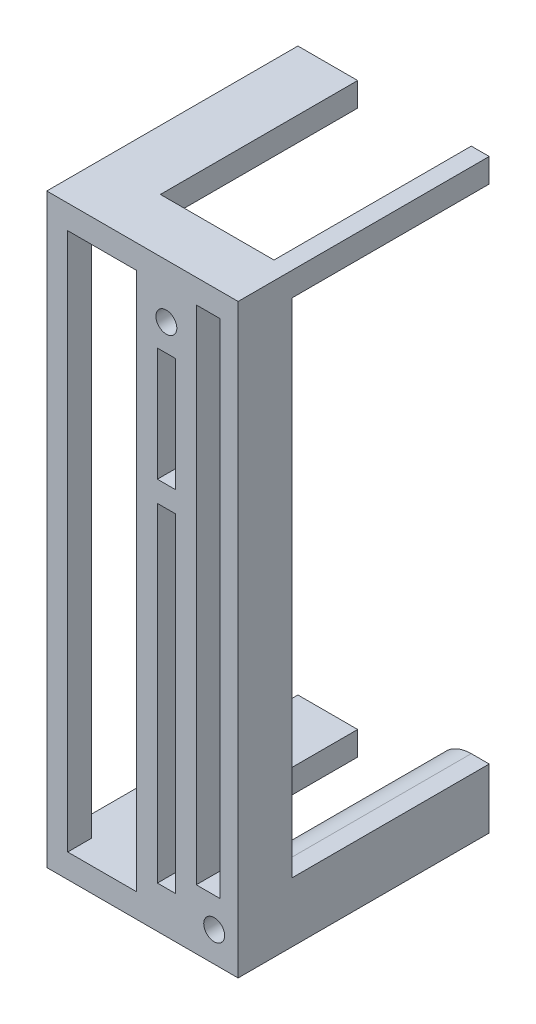
ISO-10303-21;
HEADER;
FILE_DESCRIPTION(('STEP AP214'),'2;1');
FILE_NAME('part.step','',(''),(''),'','','');
FILE_SCHEMA(('AUTOMOTIVE_DESIGN { 1 0 10303 214 1 1 1 1 }'));
ENDSEC;
DATA;
#1=APPLICATION_CONTEXT('core data for automotive mechanical design processes');
#2=APPLICATION_PROTOCOL_DEFINITION('international standard','automotive_design',2000,#1);
#3=PRODUCT_CONTEXT('',#1,'mechanical');
#4=PRODUCT('Part','Part','',(#3));
#5=PRODUCT_RELATED_PRODUCT_CATEGORY('part','',(#4));
#6=PRODUCT_DEFINITION_FORMATION('','',#4);
#7=PRODUCT_DEFINITION_CONTEXT('part definition',#1,'design');
#8=PRODUCT_DEFINITION('design','',#6,#7);
#9=PRODUCT_DEFINITION_SHAPE('','',#8);
#10=(LENGTH_UNIT() NAMED_UNIT(*) SI_UNIT(.MILLI.,.METRE.));
#11=(NAMED_UNIT(*) PLANE_ANGLE_UNIT() SI_UNIT($,.RADIAN.));
#12=(NAMED_UNIT(*) SI_UNIT($,.STERADIAN.) SOLID_ANGLE_UNIT());
#13=UNCERTAINTY_MEASURE_WITH_UNIT(LENGTH_MEASURE(1.E-05),#10,'distance_accuracy_value','');
#14=(GEOMETRIC_REPRESENTATION_CONTEXT(3) GLOBAL_UNCERTAINTY_ASSIGNED_CONTEXT((#13)) GLOBAL_UNIT_ASSIGNED_CONTEXT((#10,
#11,#12)) REPRESENTATION_CONTEXT('',''));
#15=CARTESIAN_POINT('',(0.,0.,0.));
#16=DIRECTION('',(0.,0.,1.));
#17=DIRECTION('',(1.,0.,0.));
#18=AXIS2_PLACEMENT_3D('',#15,#16,#17);
#19=CARTESIAN_POINT('',(0.,0.,4.));
#20=DIRECTION('',(0.,0.,1.));
#21=DIRECTION('',(1.,0.,0.));
#22=AXIS2_PLACEMENT_3D('',#19,#20,#21);
#23=PLANE('',#22);
#24=CARTESIAN_POINT('',(28.,5.,4.));
#25=DIRECTION('',(0.,0.,-1.));
#26=DIRECTION('',(-1.,0.,0.));
#27=AXIS2_PLACEMENT_3D('',#24,#25,#26);
#28=CIRCLE('',#27,1.75);
#29=CARTESIAN_POINT('',(26.25,5.,4.));
#30=VERTEX_POINT('',#29);
#31=EDGE_CURVE('E349',#30,#30,#28,.T.);
#32=ORIENTED_EDGE('',*,*,#31,.T.);
#33=EDGE_LOOP('',(#32));
#34=FACE_BOUND('',#33,.T.);
#35=DIRECTION('',(0.,1.,0.));
#36=VECTOR('',#35,1.);
#37=CARTESIAN_POINT('',(32.,0.,4.));
#38=LINE('',#37,#36);
#39=CARTESIAN_POINT('',(32.,0.,4.));
#40=VERTEX_POINT('',#39);
#41=CARTESIAN_POINT('',(32.,98.,4.));
#42=VERTEX_POINT('',#41);
#43=EDGE_CURVE('E463',#40,#42,#38,.T.);
#44=ORIENTED_EDGE('',*,*,#43,.T.);
#45=DIRECTION('',(1.,0.,0.));
#46=VECTOR('',#45,1.);
#47=CARTESIAN_POINT('',(0.,98.,4.));
#48=LINE('',#47,#46);
#49=CARTESIAN_POINT('',(0.,98.,4.));
#50=VERTEX_POINT('',#49);
#51=EDGE_CURVE('E465',#50,#42,#48,.T.);
#52=ORIENTED_EDGE('',*,*,#51,.F.);
#53=DIRECTION('',(0.,1.,0.));
#54=VECTOR('',#53,1.);
#55=CARTESIAN_POINT('',(0.,0.,4.));
#56=LINE('',#55,#54);
#57=CARTESIAN_POINT('',(0.,0.,4.));
#58=VERTEX_POINT('',#57);
#59=EDGE_CURVE('E469',#58,#50,#56,.T.);
#60=ORIENTED_EDGE('',*,*,#59,.F.);
#61=DIRECTION('',(1.,0.,0.));
#62=VECTOR('',#61,1.);
#63=CARTESIAN_POINT('',(0.,0.,4.));
#64=LINE('',#63,#62);
#65=EDGE_CURVE('E472',#58,#40,#64,.T.);
#66=ORIENTED_EDGE('',*,*,#65,.T.);
#67=EDGE_LOOP('',(#44,#52,#60,#66));
#68=FACE_BOUND('',#67,.T.);
#69=DIRECTION('',(0.,1.,0.));
#70=VECTOR('',#69,1.);
#71=CARTESIAN_POINT('',(21.5,0.,4.));
#72=LINE('',#71,#70);
#73=CARTESIAN_POINT('',(21.5,7.,4.));
#74=VERTEX_POINT('',#73);
#75=CARTESIAN_POINT('',(21.5,62.,4.));
#76=VERTEX_POINT('',#75);
#77=EDGE_CURVE('E474',#74,#76,#72,.T.);
#78=ORIENTED_EDGE('',*,*,#77,.F.);
#79=DIRECTION('',(-1.,0.,0.));
#80=VECTOR('',#79,1.);
#81=CARTESIAN_POINT('',(0.,7.,4.));
#82=LINE('',#81,#80);
#83=CARTESIAN_POINT('',(18.5,7.,4.));
#84=VERTEX_POINT('',#83);
#85=EDGE_CURVE('E477',#74,#84,#82,.T.);
#86=ORIENTED_EDGE('',*,*,#85,.T.);
#87=DIRECTION('',(0.,1.,0.));
#88=VECTOR('',#87,1.);
#89=CARTESIAN_POINT('',(18.5,0.,4.));
#90=LINE('',#89,#88);
#91=CARTESIAN_POINT('',(18.5,62.,4.));
#92=VERTEX_POINT('',#91);
#93=EDGE_CURVE('E480',#84,#92,#90,.T.);
#94=ORIENTED_EDGE('',*,*,#93,.T.);
#95=DIRECTION('',(1.,0.,0.));
#96=VECTOR('',#95,1.);
#97=CARTESIAN_POINT('',(0.,62.,4.));
#98=LINE('',#97,#96);
#99=EDGE_CURVE('E483',#92,#76,#98,.T.);
#100=ORIENTED_EDGE('',*,*,#99,.T.);
#101=EDGE_LOOP('',(#78,#86,#94,#100));
#102=FACE_BOUND('',#101,.T.);
#103=CARTESIAN_POINT('',(20.,89.,4.));
#104=DIRECTION('',(0.,0.,1.));
#105=DIRECTION('',(1.,0.,0.));
#106=AXIS2_PLACEMENT_3D('',#103,#104,#105);
#107=CIRCLE('',#106,1.75);
#108=CARTESIAN_POINT('',(21.75,89.,4.));
#109=VERTEX_POINT('',#108);
#110=EDGE_CURVE('E485',#109,#109,#107,.T.);
#111=ORIENTED_EDGE('',*,*,#110,.F.);
#112=EDGE_LOOP('',(#111));
#113=FACE_BOUND('',#112,.T.);
#114=DIRECTION('',(0.,-1.,0.));
#115=VECTOR('',#114,1.);
#116=CARTESIAN_POINT('',(29.,0.,4.));
#117=LINE('',#116,#115);
#118=CARTESIAN_POINT('',(29.,94.,4.));
#119=VERTEX_POINT('',#118);
#120=CARTESIAN_POINT('',(29.,10.,4.));
#121=VERTEX_POINT('',#120);
#122=EDGE_CURVE('E335',#119,#121,#117,.T.);
#123=ORIENTED_EDGE('',*,*,#122,.T.);
#124=DIRECTION('',(1.,0.,0.));
#125=VECTOR('',#124,1.);
#126=CARTESIAN_POINT('',(0.,10.,4.));
#127=LINE('',#126,#125);
#128=CARTESIAN_POINT('',(25.,10.,4.));
#129=VERTEX_POINT('',#128);
#130=EDGE_CURVE('E327',#129,#121,#127,.T.);
#131=ORIENTED_EDGE('',*,*,#130,.F.);
#132=DIRECTION('',(0.,-1.,0.));
#133=VECTOR('',#132,1.);
#134=CARTESIAN_POINT('',(25.,0.,4.));
#135=LINE('',#134,#133);
#136=CARTESIAN_POINT('',(25.,94.,4.));
#137=VERTEX_POINT('',#136);
#138=EDGE_CURVE('E329',#137,#129,#135,.T.);
#139=ORIENTED_EDGE('',*,*,#138,.F.);
#140=DIRECTION('',(1.,0.,0.));
#141=VECTOR('',#140,1.);
#142=CARTESIAN_POINT('',(0.,94.,4.));
#143=LINE('',#142,#141);
#144=EDGE_CURVE('E332',#137,#119,#143,.T.);
#145=ORIENTED_EDGE('',*,*,#144,.T.);
#146=EDGE_LOOP('',(#123,#131,#139,#145));
#147=FACE_BOUND('',#146,.T.);
#148=DIRECTION('',(1.,0.,0.));
#149=VECTOR('',#148,1.);
#150=CARTESIAN_POINT('',(0.,84.5,4.));
#151=LINE('',#150,#149);
#152=CARTESIAN_POINT('',(18.5,84.5,4.));
#153=VERTEX_POINT('',#152);
#154=CARTESIAN_POINT('',(21.5,84.5,4.));
#155=VERTEX_POINT('',#154);
#156=EDGE_CURVE('E304',#153,#155,#151,.T.);
#157=ORIENTED_EDGE('',*,*,#156,.T.);
#158=DIRECTION('',(0.,1.,0.));
#159=VECTOR('',#158,1.);
#160=CARTESIAN_POINT('',(21.5,0.,4.));
#161=LINE('',#160,#159);
#162=CARTESIAN_POINT('',(21.5,65.5,4.));
#163=VERTEX_POINT('',#162);
#164=EDGE_CURVE('E298',#163,#155,#161,.T.);
#165=ORIENTED_EDGE('',*,*,#164,.F.);
#166=DIRECTION('',(1.,0.,0.));
#167=VECTOR('',#166,1.);
#168=CARTESIAN_POINT('',(0.,65.5,4.));
#169=LINE('',#168,#167);
#170=CARTESIAN_POINT('',(18.5,65.5,4.));
#171=VERTEX_POINT('',#170);
#172=EDGE_CURVE('E300',#171,#163,#169,.T.);
#173=ORIENTED_EDGE('',*,*,#172,.F.);
#174=DIRECTION('',(0.,1.,0.));
#175=VECTOR('',#174,1.);
#176=CARTESIAN_POINT('',(18.5,0.,4.));
#177=LINE('',#176,#175);
#178=EDGE_CURVE('E70',#171,#153,#177,.T.);
#179=ORIENTED_EDGE('',*,*,#178,.T.);
#180=EDGE_LOOP('',(#157,#165,#173,#179));
#181=FACE_BOUND('',#180,.T.);
#182=DIRECTION('',(-1.,0.,0.));
#183=VECTOR('',#182,1.);
#184=CARTESIAN_POINT('',(0.,4.,4.));
#185=LINE('',#184,#183);
#186=CARTESIAN_POINT('',(15.,4.,4.));
#187=VERTEX_POINT('',#186);
#188=CARTESIAN_POINT('',(3.49999999999999,4.,4.));
#189=VERTEX_POINT('',#188);
#190=EDGE_CURVE('E273',#187,#189,#185,.T.);
#191=ORIENTED_EDGE('',*,*,#190,.T.);
#192=DIRECTION('',(0.,-1.,0.));
#193=VECTOR('',#192,1.);
#194=CARTESIAN_POINT('',(3.49999999999999,0.,4.));
#195=LINE('',#194,#193);
#196=CARTESIAN_POINT('',(3.5,94.,4.));
#197=VERTEX_POINT('',#196);
#198=EDGE_CURVE('E265',#197,#189,#195,.T.);
#199=ORIENTED_EDGE('',*,*,#198,.F.);
#200=DIRECTION('',(1.,0.,0.));
#201=VECTOR('',#200,1.);
#202=CARTESIAN_POINT('',(0.,94.,4.));
#203=LINE('',#202,#201);
#204=CARTESIAN_POINT('',(15.,94.,4.));
#205=VERTEX_POINT('',#204);
#206=EDGE_CURVE('E276',#197,#205,#203,.T.);
#207=ORIENTED_EDGE('',*,*,#206,.T.);
#208=DIRECTION('',(0.,-1.,0.));
#209=VECTOR('',#208,1.);
#210=CARTESIAN_POINT('',(15.,0.,4.));
#211=LINE('',#210,#209);
#212=EDGE_CURVE('E62',#205,#187,#211,.T.);
#213=ORIENTED_EDGE('',*,*,#212,.T.);
#214=EDGE_LOOP('',(#191,#199,#207,#213));
#215=FACE_BOUND('',#214,.T.);
#216=ADVANCED_FACE('F47',(#34,#68,#102,#113,#147,#181,#215),#23,.T.);
#217=CARTESIAN_POINT('',(0.,0.,0.));
#218=DIRECTION('',(0.,0.,1.));
#219=DIRECTION('',(1.,0.,0.));
#220=AXIS2_PLACEMENT_3D('',#217,#218,#219);
#221=PLANE('',#220);
#222=DIRECTION('',(0.,-1.,0.));
#223=VECTOR('',#222,1.);
#224=CARTESIAN_POINT('',(3.49999999999999,0.,0.));
#225=LINE('',#224,#223);
#226=CARTESIAN_POINT('',(3.49999999999999,94.,0.));
#227=VERTEX_POINT('',#226);
#228=CARTESIAN_POINT('',(3.49999999999999,4.,0.));
#229=VERTEX_POINT('',#228);
#230=EDGE_CURVE('E268',#227,#229,#225,.T.);
#231=ORIENTED_EDGE('',*,*,#230,.T.);
#232=DIRECTION('',(1.,0.,0.));
#233=VECTOR('',#232,1.);
#234=CARTESIAN_POINT('',(0.,4.,0.));
#235=LINE('',#234,#233);
#236=CARTESIAN_POINT('',(0.,4.,0.));
#237=VERTEX_POINT('',#236);
#238=EDGE_CURVE('E428',#237,#229,#235,.T.);
#239=ORIENTED_EDGE('',*,*,#238,.F.);
#240=DIRECTION('',(0.,1.,0.));
#241=VECTOR('',#240,1.);
#242=CARTESIAN_POINT('',(0.,0.,0.));
#243=LINE('',#242,#241);
#244=CARTESIAN_POINT('',(0.,94.,0.));
#245=VERTEX_POINT('',#244);
#246=EDGE_CURVE('E452',#237,#245,#243,.T.);
#247=ORIENTED_EDGE('',*,*,#246,.T.);
#248=DIRECTION('',(1.,0.,0.));
#249=VECTOR('',#248,1.);
#250=CARTESIAN_POINT('',(0.,94.,0.));
#251=LINE('',#250,#249);
#252=EDGE_CURVE('E444',#245,#227,#251,.T.);
#253=ORIENTED_EDGE('',*,*,#252,.T.);
#254=EDGE_LOOP('',(#231,#239,#247,#253));
#255=FACE_BOUND('',#254,.T.);
#256=ADVANCED_FACE('F643',(#255),#221,.F.);
#257=CARTESIAN_POINT('',(15.,4.,0.));
#258=VERTEX_POINT('',#257);
#259=CARTESIAN_POINT('',(23.,4.,0.));
#260=VERTEX_POINT('',#259);
#261=EDGE_CURVE('E446',#258,#260,#235,.T.);
#262=ORIENTED_EDGE('',*,*,#261,.F.);
#263=DIRECTION('',(0.,-1.,0.));
#264=VECTOR('',#263,1.);
#265=CARTESIAN_POINT('',(15.,0.,0.));
#266=LINE('',#265,#264);
#267=CARTESIAN_POINT('',(15.,94.,0.));
#268=VERTEX_POINT('',#267);
#269=EDGE_CURVE('E283',#268,#258,#266,.T.);
#270=ORIENTED_EDGE('',*,*,#269,.F.);
#271=CARTESIAN_POINT('',(25.,94.,0.));
#272=VERTEX_POINT('',#271);
#273=EDGE_CURVE('E421',#268,#272,#251,.T.);
#274=ORIENTED_EDGE('',*,*,#273,.T.);
#275=DIRECTION('',(0.,-1.,0.));
#276=VECTOR('',#275,1.);
#277=CARTESIAN_POINT('',(25.,0.,0.));
#278=LINE('',#277,#276);
#279=CARTESIAN_POINT('',(25.,10.,0.));
#280=VERTEX_POINT('',#279);
#281=EDGE_CURVE('E330',#272,#280,#278,.T.);
#282=ORIENTED_EDGE('',*,*,#281,.T.);
#283=DIRECTION('',(1.,0.,0.));
#284=VECTOR('',#283,1.);
#285=CARTESIAN_POINT('',(0.,10.,0.));
#286=LINE('',#285,#284);
#287=CARTESIAN_POINT('',(29.,10.,0.));
#288=VERTEX_POINT('',#287);
#289=EDGE_CURVE('E339',#280,#288,#286,.T.);
#290=ORIENTED_EDGE('',*,*,#289,.T.);
#291=CARTESIAN_POINT('',(29.,4.,0.));
#292=DIRECTION('',(0.,0.,1.));
#293=DIRECTION('',(1.,0.,0.));
#294=AXIS2_PLACEMENT_3D('',#291,#292,#293);
#295=CIRCLE('',#294,6.);
#296=EDGE_CURVE('E11',#260,#288,#295,.F.);
#297=ORIENTED_EDGE('',*,*,#296,.F.);
#298=EDGE_LOOP('',(#262,#270,#274,#282,#290,#297));
#299=FACE_BOUND('',#298,.T.);
#300=DIRECTION('',(0.,1.,0.));
#301=VECTOR('',#300,1.);
#302=CARTESIAN_POINT('',(21.5,0.,0.));
#303=LINE('',#302,#301);
#304=CARTESIAN_POINT('',(21.5,7.,0.));
#305=VERTEX_POINT('',#304);
#306=CARTESIAN_POINT('',(21.5,62.,0.));
#307=VERTEX_POINT('',#306);
#308=EDGE_CURVE('E490',#305,#307,#303,.T.);
#309=ORIENTED_EDGE('',*,*,#308,.T.);
#310=DIRECTION('',(1.,0.,0.));
#311=VECTOR('',#310,1.);
#312=CARTESIAN_POINT('',(0.,62.,0.));
#313=LINE('',#312,#311);
#314=CARTESIAN_POINT('',(18.5,62.,0.));
#315=VERTEX_POINT('',#314);
#316=EDGE_CURVE('E499',#315,#307,#313,.T.);
#317=ORIENTED_EDGE('',*,*,#316,.F.);
#318=DIRECTION('',(0.,1.,0.));
#319=VECTOR('',#318,1.);
#320=CARTESIAN_POINT('',(18.5,0.,0.));
#321=LINE('',#320,#319);
#322=CARTESIAN_POINT('',(18.5,7.,0.));
#323=VERTEX_POINT('',#322);
#324=EDGE_CURVE('E496',#323,#315,#321,.T.);
#325=ORIENTED_EDGE('',*,*,#324,.F.);
#326=DIRECTION('',(-1.,0.,0.));
#327=VECTOR('',#326,1.);
#328=CARTESIAN_POINT('',(0.,7.,0.));
#329=LINE('',#328,#327);
#330=EDGE_CURVE('E493',#305,#323,#329,.T.);
#331=ORIENTED_EDGE('',*,*,#330,.F.);
#332=EDGE_LOOP('',(#309,#317,#325,#331));
#333=FACE_BOUND('',#332,.T.);
#334=CARTESIAN_POINT('',(20.,89.,0.));
#335=DIRECTION('',(0.,0.,1.));
#336=DIRECTION('',(1.,0.,0.));
#337=AXIS2_PLACEMENT_3D('',#334,#335,#336);
#338=CIRCLE('',#337,1.75);
#339=CARTESIAN_POINT('',(21.75,89.,0.));
#340=VERTEX_POINT('',#339);
#341=EDGE_CURVE('E466',#340,#340,#338,.T.);
#342=ORIENTED_EDGE('',*,*,#341,.T.);
#343=EDGE_LOOP('',(#342));
#344=FACE_BOUND('',#343,.T.);
#345=DIRECTION('',(0.,1.,0.));
#346=VECTOR('',#345,1.);
#347=CARTESIAN_POINT('',(21.5,0.,0.));
#348=LINE('',#347,#346);
#349=CARTESIAN_POINT('',(21.5,65.5,0.));
#350=VERTEX_POINT('',#349);
#351=CARTESIAN_POINT('',(21.5,84.5,0.));
#352=VERTEX_POINT('',#351);
#353=EDGE_CURVE('E308',#350,#352,#348,.T.);
#354=ORIENTED_EDGE('',*,*,#353,.T.);
#355=DIRECTION('',(1.,0.,0.));
#356=VECTOR('',#355,1.);
#357=CARTESIAN_POINT('',(0.,84.5,0.));
#358=LINE('',#357,#356);
#359=CARTESIAN_POINT('',(18.5,84.5,0.));
#360=VERTEX_POINT('',#359);
#361=EDGE_CURVE('E301',#360,#352,#358,.T.);
#362=ORIENTED_EDGE('',*,*,#361,.F.);
#363=DIRECTION('',(0.,1.,0.));
#364=VECTOR('',#363,1.);
#365=CARTESIAN_POINT('',(18.5,0.,0.));
#366=LINE('',#365,#364);
#367=CARTESIAN_POINT('',(18.5,65.5,0.));
#368=VERTEX_POINT('',#367);
#369=EDGE_CURVE('E315',#368,#360,#366,.T.);
#370=ORIENTED_EDGE('',*,*,#369,.F.);
#371=DIRECTION('',(1.,0.,0.));
#372=VECTOR('',#371,1.);
#373=CARTESIAN_POINT('',(0.,65.5,0.));
#374=LINE('',#373,#372);
#375=EDGE_CURVE('E311',#368,#350,#374,.T.);
#376=ORIENTED_EDGE('',*,*,#375,.T.);
#377=EDGE_LOOP('',(#354,#362,#370,#376));
#378=FACE_BOUND('',#377,.T.);
#379=ADVANCED_FACE('F614',(#299,#333,#344,#378),#221,.F.);
#380=CARTESIAN_POINT('',(29.,4.,-5.));
#381=DIRECTION('',(0.,0.,1.));
#382=DIRECTION('',(1.,0.,0.));
#383=AXIS2_PLACEMENT_3D('',#380,#381,#382);
#384=CYLINDRICAL_SURFACE('',#383,6.);
#385=DIRECTION('',(0.,0.,-1.));
#386=VECTOR('',#385,1.);
#387=CARTESIAN_POINT('',(23.,4.,-5.));
#388=LINE('',#387,#386);
#389=CARTESIAN_POINT('',(23.,4.,-5.));
#390=VERTEX_POINT('',#389);
#391=CARTESIAN_POINT('',(23.,4.,-38.));
#392=VERTEX_POINT('',#391);
#393=EDGE_CURVE('E538',#390,#392,#388,.T.);
#394=ORIENTED_EDGE('',*,*,#393,.F.);
#395=DIRECTION('',(0.,0.,1.));
#396=VECTOR('',#395,1.);
#397=CARTESIAN_POINT('',(23.,4.,-5.));
#398=LINE('',#397,#396);
#399=EDGE_CURVE('E453',#390,#260,#398,.T.);
#400=ORIENTED_EDGE('',*,*,#399,.T.);
#401=ORIENTED_EDGE('',*,*,#296,.T.);
#402=DIRECTION('',(0.,0.,1.));
#403=VECTOR('',#402,1.);
#404=CARTESIAN_POINT('',(29.,10.,-5.));
#405=LINE('',#404,#403);
#406=CARTESIAN_POINT('',(29.,10.,-5.));
#407=VERTEX_POINT('',#406);
#408=EDGE_CURVE('E456',#407,#288,#405,.T.);
#409=ORIENTED_EDGE('',*,*,#408,.F.);
#410=DIRECTION('',(0.,0.,-1.));
#411=VECTOR('',#410,1.);
#412=CARTESIAN_POINT('',(29.,10.,-5.));
#413=LINE('',#412,#411);
#414=CARTESIAN_POINT('',(29.,10.,-38.));
#415=VERTEX_POINT('',#414);
#416=EDGE_CURVE('E541',#415,#407,#413,.F.);
#417=ORIENTED_EDGE('',*,*,#416,.F.);
#418=CARTESIAN_POINT('',(29.,4.,-38.));
#419=DIRECTION('',(0.,0.,1.));
#420=DIRECTION('',(1.,0.,0.));
#421=AXIS2_PLACEMENT_3D('',#418,#419,#420);
#422=CIRCLE('',#421,6.);
#423=EDGE_CURVE('E55',#392,#415,#422,.F.);
#424=ORIENTED_EDGE('',*,*,#423,.F.);
#425=EDGE_LOOP('',(#394,#400,#401,#409,#417,#424));
#426=FACE_BOUND('',#425,.T.);
#427=ADVANCED_FACE('F49',(#426),#384,.T.);
#428=CARTESIAN_POINT('',(0.,0.,-5.));
#429=DIRECTION('',(0.,0.,1.));
#430=DIRECTION('',(1.,0.,0.));
#431=AXIS2_PLACEMENT_3D('',#428,#429,#430);
#432=PLANE('',#431);
#433=DIRECTION('',(0.,1.,0.));
#434=VECTOR('',#433,1.);
#435=CARTESIAN_POINT('',(29.,0.,-5.));
#436=LINE('',#435,#434);
#437=CARTESIAN_POINT('',(29.,94.,-5.));
#438=VERTEX_POINT('',#437);
#439=CARTESIAN_POINT('',(29.,98.,-5.));
#440=VERTEX_POINT('',#439);
#441=EDGE_CURVE('E536',#438,#440,#436,.T.);
#442=ORIENTED_EDGE('',*,*,#441,.F.);
#443=DIRECTION('',(1.,0.,0.));
#444=VECTOR('',#443,1.);
#445=CARTESIAN_POINT('',(0.,94.,-5.));
#446=LINE('',#445,#444);
#447=CARTESIAN_POINT('',(10.,94.,-5.));
#448=VERTEX_POINT('',#447);
#449=EDGE_CURVE('E431',#448,#438,#446,.T.);
#450=ORIENTED_EDGE('',*,*,#449,.F.);
#451=DIRECTION('',(0.,1.,0.));
#452=VECTOR('',#451,1.);
#453=CARTESIAN_POINT('',(10.,0.,-5.));
#454=LINE('',#453,#452);
#455=CARTESIAN_POINT('',(10.,98.,-5.));
#456=VERTEX_POINT('',#455);
#457=EDGE_CURVE('E530',#448,#456,#454,.T.);
#458=ORIENTED_EDGE('',*,*,#457,.T.);
#459=DIRECTION('',(1.,0.,0.));
#460=VECTOR('',#459,1.);
#461=CARTESIAN_POINT('',(0.,98.,-5.));
#462=LINE('',#461,#460);
#463=EDGE_CURVE('E427',#456,#440,#462,.T.);
#464=ORIENTED_EDGE('',*,*,#463,.T.);
#465=EDGE_LOOP('',(#442,#450,#458,#464));
#466=FACE_BOUND('',#465,.T.);
#467=ADVANCED_FACE('F570',(#466),#432,.F.);
#468=DIRECTION('',(0.,1.,0.));
#469=VECTOR('',#468,1.);
#470=CARTESIAN_POINT('',(23.,0.,-5.));
#471=LINE('',#470,#469);
#472=CARTESIAN_POINT('',(23.,0.,-5.));
#473=VERTEX_POINT('',#472);
#474=EDGE_CURVE('E527',#473,#390,#471,.T.);
#475=ORIENTED_EDGE('',*,*,#474,.F.);
#476=DIRECTION('',(1.,0.,0.));
#477=VECTOR('',#476,1.);
#478=CARTESIAN_POINT('',(0.,0.,-5.));
#479=LINE('',#478,#477);
#480=CARTESIAN_POINT('',(10.,0.,-5.));
#481=VERTEX_POINT('',#480);
#482=EDGE_CURVE('E440',#481,#473,#479,.T.);
#483=ORIENTED_EDGE('',*,*,#482,.F.);
#484=DIRECTION('',(0.,1.,0.));
#485=VECTOR('',#484,1.);
#486=CARTESIAN_POINT('',(10.,0.,-5.));
#487=LINE('',#486,#485);
#488=CARTESIAN_POINT('',(10.,4.,-5.));
#489=VERTEX_POINT('',#488);
#490=EDGE_CURVE('E515',#481,#489,#487,.T.);
#491=ORIENTED_EDGE('',*,*,#490,.T.);
#492=DIRECTION('',(1.,0.,0.));
#493=VECTOR('',#492,1.);
#494=CARTESIAN_POINT('',(0.,4.,-5.));
#495=LINE('',#494,#493);
#496=EDGE_CURVE('E437',#489,#390,#495,.T.);
#497=ORIENTED_EDGE('',*,*,#496,.T.);
#498=EDGE_LOOP('',(#475,#483,#491,#497));
#499=FACE_BOUND('',#498,.T.);
#500=ADVANCED_FACE('F674',(#499),#432,.F.);
#501=CARTESIAN_POINT('',(21.5,0.,4.));
#502=DIRECTION('',(-1.,0.,0.));
#503=DIRECTION('',(0.,0.,1.));
#504=AXIS2_PLACEMENT_3D('',#501,#502,#503);
#505=PLANE('',#504);
#506=ORIENTED_EDGE('',*,*,#308,.F.);
#507=DIRECTION('',(0.,0.,-1.));
#508=VECTOR('',#507,1.);
#509=CARTESIAN_POINT('',(21.5,7.,4.));
#510=LINE('',#509,#508);
#511=EDGE_CURVE('E513',#74,#305,#510,.T.);
#512=ORIENTED_EDGE('',*,*,#511,.F.);
#513=ORIENTED_EDGE('',*,*,#77,.T.);
#514=DIRECTION('',(0.,0.,-1.));
#515=VECTOR('',#514,1.);
#516=CARTESIAN_POINT('',(21.5,62.,4.));
#517=LINE('',#516,#515);
#518=EDGE_CURVE('E504',#76,#307,#517,.T.);
#519=ORIENTED_EDGE('',*,*,#518,.T.);
#520=EDGE_LOOP('',(#506,#512,#513,#519));
#521=FACE_BOUND('',#520,.T.);
#522=ADVANCED_FACE('F670',(#521),#505,.T.);
#523=CARTESIAN_POINT('',(0.,7.,4.));
#524=DIRECTION('',(0.,-1.,0.));
#525=DIRECTION('',(0.,0.,-1.));
#526=AXIS2_PLACEMENT_3D('',#523,#524,#525);
#527=PLANE('',#526);
#528=ORIENTED_EDGE('',*,*,#330,.T.);
#529=DIRECTION('',(0.,0.,-1.));
#530=VECTOR('',#529,1.);
#531=CARTESIAN_POINT('',(18.5,7.,4.));
#532=LINE('',#531,#530);
#533=EDGE_CURVE('E510',#84,#323,#532,.T.);
#534=ORIENTED_EDGE('',*,*,#533,.F.);
#535=ORIENTED_EDGE('',*,*,#85,.F.);
#536=ORIENTED_EDGE('',*,*,#511,.T.);
#537=EDGE_LOOP('',(#528,#534,#535,#536));
#538=FACE_BOUND('',#537,.T.);
#539=ADVANCED_FACE('F666',(#538),#527,.F.);
#540=CARTESIAN_POINT('',(18.5,0.,4.));
#541=DIRECTION('',(-1.,0.,0.));
#542=DIRECTION('',(0.,0.,1.));
#543=AXIS2_PLACEMENT_3D('',#540,#541,#542);
#544=PLANE('',#543);
#545=ORIENTED_EDGE('',*,*,#324,.T.);
#546=DIRECTION('',(0.,0.,-1.));
#547=VECTOR('',#546,1.);
#548=CARTESIAN_POINT('',(18.5,62.,4.));
#549=LINE('',#548,#547);
#550=EDGE_CURVE('E506',#92,#315,#549,.T.);
#551=ORIENTED_EDGE('',*,*,#550,.F.);
#552=ORIENTED_EDGE('',*,*,#93,.F.);
#553=ORIENTED_EDGE('',*,*,#533,.T.);
#554=EDGE_LOOP('',(#545,#551,#552,#553));
#555=FACE_BOUND('',#554,.T.);
#556=ADVANCED_FACE('F663',(#555),#544,.F.);
#557=CARTESIAN_POINT('',(32.,0.,4.));
#558=DIRECTION('',(-1.,0.,0.));
#559=DIRECTION('',(0.,0.,1.));
#560=AXIS2_PLACEMENT_3D('',#557,#558,#559);
#561=PLANE('',#560);
#562=DIRECTION('',(0.,1.,0.));
#563=VECTOR('',#562,1.);
#564=CARTESIAN_POINT('',(32.,0.,-5.));
#565=LINE('',#564,#563);
#566=CARTESIAN_POINT('',(32.,10.,-5.));
#567=VERTEX_POINT('',#566);
#568=CARTESIAN_POINT('',(32.,94.,-5.));
#569=VERTEX_POINT('',#568);
#570=EDGE_CURVE('E424',#567,#569,#565,.T.);
#571=ORIENTED_EDGE('',*,*,#570,.T.);
#572=DIRECTION('',(0.,0.,1.));
#573=VECTOR('',#572,1.);
#574=CARTESIAN_POINT('',(32.,94.,-38.));
#575=LINE('',#574,#573);
#576=CARTESIAN_POINT('',(32.,94.,-38.));
#577=VERTEX_POINT('',#576);
#578=EDGE_CURVE('E371',#577,#569,#575,.T.);
#579=ORIENTED_EDGE('',*,*,#578,.F.);
#580=DIRECTION('',(0.,1.,0.));
#581=VECTOR('',#580,1.);
#582=CARTESIAN_POINT('',(32.,0.,-38.));
#583=LINE('',#582,#581);
#584=CARTESIAN_POINT('',(32.,98.,-38.));
#585=VERTEX_POINT('',#584);
#586=EDGE_CURVE('E360',#577,#585,#583,.T.);
#587=ORIENTED_EDGE('',*,*,#586,.T.);
#588=DIRECTION('',(0.,0.,-1.));
#589=VECTOR('',#588,1.);
#590=CARTESIAN_POINT('',(32.,98.,4.));
#591=LINE('',#590,#589);
#592=EDGE_CURVE('E507',#42,#585,#591,.T.);
#593=ORIENTED_EDGE('',*,*,#592,.F.);
#594=ORIENTED_EDGE('',*,*,#43,.F.);
#595=DIRECTION('',(0.,0.,-1.));
#596=VECTOR('',#595,1.);
#597=CARTESIAN_POINT('',(32.,0.,4.));
#598=LINE('',#597,#596);
#599=CARTESIAN_POINT('',(32.,0.,-38.));
#600=VERTEX_POINT('',#599);
#601=EDGE_CURVE('E488',#40,#600,#598,.T.);
#602=ORIENTED_EDGE('',*,*,#601,.T.);
#603=DIRECTION('',(0.,1.,0.));
#604=VECTOR('',#603,1.);
#605=CARTESIAN_POINT('',(32.,0.,-38.));
#606=LINE('',#605,#604);
#607=CARTESIAN_POINT('',(32.,10.,-38.));
#608=VERTEX_POINT('',#607);
#609=EDGE_CURVE('E388',#600,#608,#606,.T.);
#610=ORIENTED_EDGE('',*,*,#609,.T.);
#611=DIRECTION('',(0.,0.,1.));
#612=VECTOR('',#611,1.);
#613=CARTESIAN_POINT('',(32.,10.,-38.));
#614=LINE('',#613,#612);
#615=EDGE_CURVE('E402',#608,#567,#614,.T.);
#616=ORIENTED_EDGE('',*,*,#615,.T.);
#617=EDGE_LOOP('',(#571,#579,#587,#593,#594,#602,#610,#616));
#618=FACE_BOUND('',#617,.T.);
#619=ADVANCED_FACE('F556',(#618),#561,.F.);
#620=CARTESIAN_POINT('',(0.,98.,4.));
#621=DIRECTION('',(0.,1.,0.));
#622=DIRECTION('',(0.,0.,1.));
#623=AXIS2_PLACEMENT_3D('',#620,#621,#622);
#624=PLANE('',#623);
#625=DIRECTION('',(0.,0.,1.));
#626=VECTOR('',#625,1.);
#627=CARTESIAN_POINT('',(29.,98.,-38.));
#628=LINE('',#627,#626);
#629=CARTESIAN_POINT('',(29.,98.,-38.));
#630=VERTEX_POINT('',#629);
#631=EDGE_CURVE('E367',#630,#440,#628,.T.);
#632=ORIENTED_EDGE('',*,*,#631,.T.);
#633=ORIENTED_EDGE('',*,*,#463,.F.);
#634=DIRECTION('',(0.,0.,1.));
#635=VECTOR('',#634,1.);
#636=CARTESIAN_POINT('',(10.,98.,-38.));
#637=LINE('',#636,#635);
#638=CARTESIAN_POINT('',(10.,98.,-38.));
#639=VERTEX_POINT('',#638);
#640=EDGE_CURVE('E386',#639,#456,#637,.T.);
#641=ORIENTED_EDGE('',*,*,#640,.F.);
#642=DIRECTION('',(1.,0.,0.));
#643=VECTOR('',#642,1.);
#644=CARTESIAN_POINT('',(0.,98.,-38.));
#645=LINE('',#644,#643);
#646=CARTESIAN_POINT('',(0.,98.,-38.));
#647=VERTEX_POINT('',#646);
#648=EDGE_CURVE('E380',#647,#639,#645,.T.);
#649=ORIENTED_EDGE('',*,*,#648,.F.);
#650=DIRECTION('',(0.,0.,-1.));
#651=VECTOR('',#650,1.);
#652=CARTESIAN_POINT('',(0.,98.,4.));
#653=LINE('',#652,#651);
#654=EDGE_CURVE('E519',#50,#647,#653,.T.);
#655=ORIENTED_EDGE('',*,*,#654,.F.);
#656=ORIENTED_EDGE('',*,*,#51,.T.);
#657=ORIENTED_EDGE('',*,*,#592,.T.);
#658=DIRECTION('',(1.,0.,0.));
#659=VECTOR('',#658,1.);
#660=CARTESIAN_POINT('',(0.,98.,-38.));
#661=LINE('',#660,#659);
#662=EDGE_CURVE('E363',#630,#585,#661,.T.);
#663=ORIENTED_EDGE('',*,*,#662,.F.);
#664=EDGE_LOOP('',(#632,#633,#641,#649,#655,#656,#657,#663));
#665=FACE_BOUND('',#664,.T.);
#666=ADVANCED_FACE('F583',(#665),#624,.T.);
#667=CARTESIAN_POINT('',(0.,0.,4.));
#668=DIRECTION('',(-1.,0.,0.));
#669=DIRECTION('',(0.,0.,1.));
#670=AXIS2_PLACEMENT_3D('',#667,#668,#669);
#671=PLANE('',#670);
#672=ORIENTED_EDGE('',*,*,#654,.T.);
#673=DIRECTION('',(0.,1.,0.));
#674=VECTOR('',#673,1.);
#675=CARTESIAN_POINT('',(0.,0.,-38.));
#676=LINE('',#675,#674);
#677=CARTESIAN_POINT('',(0.,94.,-38.));
#678=VERTEX_POINT('',#677);
#679=EDGE_CURVE('E382',#678,#647,#676,.T.);
#680=ORIENTED_EDGE('',*,*,#679,.F.);
#681=DIRECTION('',(0.,0.,1.));
#682=VECTOR('',#681,1.);
#683=CARTESIAN_POINT('',(0.,94.,-5.));
#684=LINE('',#683,#682);
#685=EDGE_CURVE('E443',#678,#245,#684,.T.);
#686=ORIENTED_EDGE('',*,*,#685,.T.);
#687=ORIENTED_EDGE('',*,*,#246,.F.);
#688=DIRECTION('',(0.,0.,1.));
#689=VECTOR('',#688,1.);
#690=CARTESIAN_POINT('',(0.,4.,-5.));
#691=LINE('',#690,#689);
#692=CARTESIAN_POINT('',(0.,4.,-38.));
#693=VERTEX_POINT('',#692);
#694=EDGE_CURVE('E449',#693,#237,#691,.T.);
#695=ORIENTED_EDGE('',*,*,#694,.F.);
#696=DIRECTION('',(0.,1.,0.));
#697=VECTOR('',#696,1.);
#698=CARTESIAN_POINT('',(0.,0.,-38.));
#699=LINE('',#698,#697);
#700=CARTESIAN_POINT('',(0.,0.,-38.));
#701=VERTEX_POINT('',#700);
#702=EDGE_CURVE('E415',#701,#693,#699,.T.);
#703=ORIENTED_EDGE('',*,*,#702,.F.);
#704=DIRECTION('',(0.,0.,-1.));
#705=VECTOR('',#704,1.);
#706=CARTESIAN_POINT('',(0.,0.,4.));
#707=LINE('',#706,#705);
#708=EDGE_CURVE('E517',#58,#701,#707,.T.);
#709=ORIENTED_EDGE('',*,*,#708,.F.);
#710=ORIENTED_EDGE('',*,*,#59,.T.);
#711=EDGE_LOOP('',(#672,#680,#686,#687,#695,#703,#709,#710));
#712=FACE_BOUND('',#711,.T.);
#713=ADVANCED_FACE('F594',(#712),#671,.T.);
#714=CARTESIAN_POINT('',(0.,62.,4.));
#715=DIRECTION('',(0.,1.,0.));
#716=DIRECTION('',(0.,0.,1.));
#717=AXIS2_PLACEMENT_3D('',#714,#715,#716);
#718=PLANE('',#717);
#719=ORIENTED_EDGE('',*,*,#316,.T.);
#720=ORIENTED_EDGE('',*,*,#518,.F.);
#721=ORIENTED_EDGE('',*,*,#99,.F.);
#722=ORIENTED_EDGE('',*,*,#550,.T.);
#723=EDGE_LOOP('',(#719,#720,#721,#722));
#724=FACE_BOUND('',#723,.T.);
#725=ADVANCED_FACE('F659',(#724),#718,.F.);
#726=CARTESIAN_POINT('',(0.,0.,4.));
#727=DIRECTION('',(0.,1.,0.));
#728=DIRECTION('',(-1.,0.,0.));
#729=AXIS2_PLACEMENT_3D('',#726,#727,#728);
#730=PLANE('',#729);
#731=ORIENTED_EDGE('',*,*,#482,.T.);
#732=DIRECTION('',(0.,0.,1.));
#733=VECTOR('',#732,1.);
#734=CARTESIAN_POINT('',(23.,0.,-38.));
#735=LINE('',#734,#733);
#736=CARTESIAN_POINT('',(23.,0.,-38.));
#737=VERTEX_POINT('',#736);
#738=EDGE_CURVE('E403',#737,#473,#735,.T.);
#739=ORIENTED_EDGE('',*,*,#738,.F.);
#740=DIRECTION('',(1.,0.,0.));
#741=VECTOR('',#740,1.);
#742=CARTESIAN_POINT('',(0.,0.,-38.));
#743=LINE('',#742,#741);
#744=EDGE_CURVE('E399',#737,#600,#743,.T.);
#745=ORIENTED_EDGE('',*,*,#744,.T.);
#746=ORIENTED_EDGE('',*,*,#601,.F.);
#747=ORIENTED_EDGE('',*,*,#65,.F.);
#748=ORIENTED_EDGE('',*,*,#708,.T.);
#749=DIRECTION('',(1.,0.,0.));
#750=VECTOR('',#749,1.);
#751=CARTESIAN_POINT('',(0.,0.,-38.));
#752=LINE('',#751,#750);
#753=CARTESIAN_POINT('',(10.,0.,-38.));
#754=VERTEX_POINT('',#753);
#755=EDGE_CURVE('E405',#701,#754,#752,.T.);
#756=ORIENTED_EDGE('',*,*,#755,.T.);
#757=DIRECTION('',(0.,0.,1.));
#758=VECTOR('',#757,1.);
#759=CARTESIAN_POINT('',(10.,0.,-38.));
#760=LINE('',#759,#758);
#761=EDGE_CURVE('E418',#754,#481,#760,.T.);
#762=ORIENTED_EDGE('',*,*,#761,.T.);
#763=EDGE_LOOP('',(#731,#739,#745,#746,#747,#748,#756,#762));
#764=FACE_BOUND('',#763,.T.);
#765=ADVANCED_FACE('F600',(#764),#730,.F.);
#766=CARTESIAN_POINT('',(20.,89.,4.));
#767=DIRECTION('',(0.,0.,-1.));
#768=DIRECTION('',(-1.,0.,0.));
#769=AXIS2_PLACEMENT_3D('',#766,#767,#768);
#770=CYLINDRICAL_SURFACE('',#769,1.75);
#771=ORIENTED_EDGE('',*,*,#110,.T.);
#772=EDGE_LOOP('',(#771));
#773=FACE_BOUND('',#772,.T.);
#774=ORIENTED_EDGE('',*,*,#341,.F.);
#775=EDGE_LOOP('',(#774));
#776=FACE_BOUND('',#775,.T.);
#777=ADVANCED_FACE('F655',(#773,#776),#770,.F.);
#778=CARTESIAN_POINT('',(0.,4.,-5.));
#779=DIRECTION('',(0.,-1.,0.));
#780=DIRECTION('',(0.,0.,-1.));
#781=AXIS2_PLACEMENT_3D('',#778,#779,#780);
#782=PLANE('',#781);
#783=ORIENTED_EDGE('',*,*,#496,.F.);
#784=DIRECTION('',(0.,0.,1.));
#785=VECTOR('',#784,1.);
#786=CARTESIAN_POINT('',(10.,4.,-38.));
#787=LINE('',#786,#785);
#788=CARTESIAN_POINT('',(10.,4.,-38.));
#789=VERTEX_POINT('',#788);
#790=EDGE_CURVE('E419',#789,#489,#787,.T.);
#791=ORIENTED_EDGE('',*,*,#790,.F.);
#792=DIRECTION('',(1.,0.,0.));
#793=VECTOR('',#792,1.);
#794=CARTESIAN_POINT('',(0.,4.,-38.));
#795=LINE('',#794,#793);
#796=EDGE_CURVE('E413',#693,#789,#795,.T.);
#797=ORIENTED_EDGE('',*,*,#796,.F.);
#798=ORIENTED_EDGE('',*,*,#694,.T.);
#799=ORIENTED_EDGE('',*,*,#238,.T.);
#800=DIRECTION('',(0.,0.,-1.));
#801=VECTOR('',#800,1.);
#802=CARTESIAN_POINT('',(3.49999999999999,4.,4.));
#803=LINE('',#802,#801);
#804=EDGE_CURVE('E292',#189,#229,#803,.T.);
#805=ORIENTED_EDGE('',*,*,#804,.F.);
#806=ORIENTED_EDGE('',*,*,#190,.F.);
#807=DIRECTION('',(0.,0.,-1.));
#808=VECTOR('',#807,1.);
#809=CARTESIAN_POINT('',(15.,4.,4.));
#810=LINE('',#809,#808);
#811=EDGE_CURVE('E295',#187,#258,#810,.T.);
#812=ORIENTED_EDGE('',*,*,#811,.T.);
#813=ORIENTED_EDGE('',*,*,#261,.T.);
#814=ORIENTED_EDGE('',*,*,#399,.F.);
#815=EDGE_LOOP('',(#783,#791,#797,#798,#799,#805,#806,#812,#813,#814));
#816=FACE_BOUND('',#815,.T.);
#817=ADVANCED_FACE('F609',(#816),#782,.F.);
#818=CARTESIAN_POINT('',(23.,0.,-5.));
#819=DIRECTION('',(1.,0.,0.));
#820=DIRECTION('',(0.,0.,-1.));
#821=AXIS2_PLACEMENT_3D('',#818,#819,#820);
#822=PLANE('',#821);
#823=ORIENTED_EDGE('',*,*,#474,.T.);
#824=ORIENTED_EDGE('',*,*,#393,.T.);
#825=DIRECTION('',(0.,1.,0.));
#826=VECTOR('',#825,1.);
#827=CARTESIAN_POINT('',(23.,0.,-38.));
#828=LINE('',#827,#826);
#829=EDGE_CURVE('E396',#737,#392,#828,.T.);
#830=ORIENTED_EDGE('',*,*,#829,.F.);
#831=ORIENTED_EDGE('',*,*,#738,.T.);
#832=EDGE_LOOP('',(#823,#824,#830,#831));
#833=FACE_BOUND('',#832,.T.);
#834=ADVANCED_FACE('F604',(#833),#822,.F.);
#835=CARTESIAN_POINT('',(0.,10.,-5.));
#836=DIRECTION('',(0.,1.,0.));
#837=DIRECTION('',(0.,0.,1.));
#838=AXIS2_PLACEMENT_3D('',#835,#836,#837);
#839=PLANE('',#838);
#840=DIRECTION('',(-1.,0.,0.));
#841=VECTOR('',#840,1.);
#842=CARTESIAN_POINT('',(0.,10.,-38.));
#843=LINE('',#842,#841);
#844=EDGE_CURVE('E393',#608,#415,#843,.T.);
#845=ORIENTED_EDGE('',*,*,#844,.T.);
#846=ORIENTED_EDGE('',*,*,#416,.T.);
#847=DIRECTION('',(-1.,0.,0.));
#848=VECTOR('',#847,1.);
#849=CARTESIAN_POINT('',(0.,10.,-5.));
#850=LINE('',#849,#848);
#851=EDGE_CURVE('E524',#567,#407,#850,.T.);
#852=ORIENTED_EDGE('',*,*,#851,.F.);
#853=ORIENTED_EDGE('',*,*,#615,.F.);
#854=EDGE_LOOP('',(#845,#846,#852,#853));
#855=FACE_BOUND('',#854,.T.);
#856=ADVANCED_FACE('F553',(#855),#839,.T.);
#857=CARTESIAN_POINT('',(29.,0.,-5.));
#858=DIRECTION('',(1.,0.,0.));
#859=DIRECTION('',(0.,0.,-1.));
#860=AXIS2_PLACEMENT_3D('',#857,#858,#859);
#861=PLANE('',#860);
#862=ORIENTED_EDGE('',*,*,#408,.T.);
#863=DIRECTION('',(0.,0.,-1.));
#864=VECTOR('',#863,1.);
#865=CARTESIAN_POINT('',(29.,10.,4.));
#866=LINE('',#865,#864);
#867=EDGE_CURVE('E312',#121,#288,#866,.T.);
#868=ORIENTED_EDGE('',*,*,#867,.F.);
#869=ORIENTED_EDGE('',*,*,#122,.F.);
#870=DIRECTION('',(0.,0.,1.));
#871=VECTOR('',#870,1.);
#872=CARTESIAN_POINT('',(29.,94.,-5.));
#873=LINE('',#872,#871);
#874=EDGE_CURVE('E459',#438,#119,#873,.T.);
#875=ORIENTED_EDGE('',*,*,#874,.F.);
#876=DIRECTION('',(0.,1.,0.));
#877=VECTOR('',#876,1.);
#878=CARTESIAN_POINT('',(29.,0.,-5.));
#879=LINE('',#878,#877);
#880=EDGE_CURVE('E434',#407,#438,#879,.T.);
#881=ORIENTED_EDGE('',*,*,#880,.F.);
#882=EDGE_LOOP('',(#862,#868,#869,#875,#881));
#883=FACE_BOUND('',#882,.T.);
#884=ADVANCED_FACE('F624',(#883),#861,.F.);
#885=CARTESIAN_POINT('',(0.,94.,-5.));
#886=DIRECTION('',(0.,-1.,0.));
#887=DIRECTION('',(0.,0.,-1.));
#888=AXIS2_PLACEMENT_3D('',#885,#886,#887);
#889=PLANE('',#888);
#890=ORIENTED_EDGE('',*,*,#874,.T.);
#891=ORIENTED_EDGE('',*,*,#144,.F.);
#892=DIRECTION('',(0.,0.,-1.));
#893=VECTOR('',#892,1.);
#894=CARTESIAN_POINT('',(25.,94.,4.));
#895=LINE('',#894,#893);
#896=EDGE_CURVE('E345',#137,#272,#895,.T.);
#897=ORIENTED_EDGE('',*,*,#896,.T.);
#898=ORIENTED_EDGE('',*,*,#273,.F.);
#899=DIRECTION('',(0.,0.,-1.));
#900=VECTOR('',#899,1.);
#901=CARTESIAN_POINT('',(15.,94.,4.));
#902=LINE('',#901,#900);
#903=EDGE_CURVE('E272',#205,#268,#902,.T.);
#904=ORIENTED_EDGE('',*,*,#903,.F.);
#905=ORIENTED_EDGE('',*,*,#206,.F.);
#906=DIRECTION('',(0.,0.,-1.));
#907=VECTOR('',#906,1.);
#908=CARTESIAN_POINT('',(3.5,94.,4.));
#909=LINE('',#908,#907);
#910=EDGE_CURVE('E261',#197,#227,#909,.T.);
#911=ORIENTED_EDGE('',*,*,#910,.T.);
#912=ORIENTED_EDGE('',*,*,#252,.F.);
#913=ORIENTED_EDGE('',*,*,#685,.F.);
#914=DIRECTION('',(1.,0.,0.));
#915=VECTOR('',#914,1.);
#916=CARTESIAN_POINT('',(0.,94.,-38.));
#917=LINE('',#916,#915);
#918=CARTESIAN_POINT('',(10.,94.,-38.));
#919=VERTEX_POINT('',#918);
#920=EDGE_CURVE('E370',#678,#919,#917,.T.);
#921=ORIENTED_EDGE('',*,*,#920,.T.);
#922=DIRECTION('',(0.,0.,1.));
#923=VECTOR('',#922,1.);
#924=CARTESIAN_POINT('',(10.,94.,-38.));
#925=LINE('',#924,#923);
#926=EDGE_CURVE('E385',#919,#448,#925,.T.);
#927=ORIENTED_EDGE('',*,*,#926,.T.);
#928=ORIENTED_EDGE('',*,*,#449,.T.);
#929=EDGE_LOOP('',(#890,#891,#897,#898,#904,#905,#911,#912,#913,#921,#927,#928));
#930=FACE_BOUND('',#929,.T.);
#931=ADVANCED_FACE('F277',(#930),#889,.T.);
#932=ORIENTED_EDGE('',*,*,#880,.T.);
#933=DIRECTION('',(1.,0.,0.));
#934=VECTOR('',#933,1.);
#935=CARTESIAN_POINT('',(0.,94.,-5.));
#936=LINE('',#935,#934);
#937=EDGE_CURVE('E533',#438,#569,#936,.T.);
#938=ORIENTED_EDGE('',*,*,#937,.T.);
#939=ORIENTED_EDGE('',*,*,#570,.F.);
#940=ORIENTED_EDGE('',*,*,#851,.T.);
#941=EDGE_LOOP('',(#932,#938,#939,#940));
#942=FACE_BOUND('',#941,.T.);
#943=ADVANCED_FACE('F558',(#942),#432,.F.);
#944=CARTESIAN_POINT('',(10.,0.,-38.));
#945=DIRECTION('',(1.,0.,0.));
#946=DIRECTION('',(0.,0.,-1.));
#947=AXIS2_PLACEMENT_3D('',#944,#945,#946);
#948=PLANE('',#947);
#949=ORIENTED_EDGE('',*,*,#490,.F.);
#950=ORIENTED_EDGE('',*,*,#761,.F.);
#951=DIRECTION('',(0.,1.,0.));
#952=VECTOR('',#951,1.);
#953=CARTESIAN_POINT('',(10.,0.,-38.));
#954=LINE('',#953,#952);
#955=EDGE_CURVE('E410',#754,#789,#954,.T.);
#956=ORIENTED_EDGE('',*,*,#955,.T.);
#957=ORIENTED_EDGE('',*,*,#790,.T.);
#958=EDGE_LOOP('',(#949,#950,#956,#957));
#959=FACE_BOUND('',#958,.T.);
#960=ADVANCED_FACE('F714',(#959),#948,.T.);
#961=CARTESIAN_POINT('',(0.,0.,-38.));
#962=DIRECTION('',(0.,0.,1.));
#963=DIRECTION('',(1.,0.,0.));
#964=AXIS2_PLACEMENT_3D('',#961,#962,#963);
#965=PLANE('',#964);
#966=ORIENTED_EDGE('',*,*,#755,.F.);
#967=ORIENTED_EDGE('',*,*,#702,.T.);
#968=ORIENTED_EDGE('',*,*,#796,.T.);
#969=ORIENTED_EDGE('',*,*,#955,.F.);
#970=EDGE_LOOP('',(#966,#967,#968,#969));
#971=FACE_BOUND('',#970,.T.);
#972=ADVANCED_FACE('F723',(#971),#965,.F.);
#973=CARTESIAN_POINT('',(0.,0.,-38.));
#974=DIRECTION('',(0.,0.,1.));
#975=DIRECTION('',(1.,0.,0.));
#976=AXIS2_PLACEMENT_3D('',#973,#974,#975);
#977=PLANE('',#976);
#978=CARTESIAN_POINT('',(28.,5.,-38.));
#979=DIRECTION('',(0.,0.,-1.));
#980=DIRECTION('',(-1.,0.,0.));
#981=AXIS2_PLACEMENT_3D('',#978,#979,#980);
#982=CIRCLE('',#981,1.75);
#983=CARTESIAN_POINT('',(26.25,5.,-38.));
#984=VERTEX_POINT('',#983);
#985=EDGE_CURVE('E294',#984,#984,#982,.T.);
#986=ORIENTED_EDGE('',*,*,#985,.F.);
#987=EDGE_LOOP('',(#986));
#988=FACE_BOUND('',#987,.T.);
#989=ORIENTED_EDGE('',*,*,#829,.T.);
#990=ORIENTED_EDGE('',*,*,#423,.T.);
#991=ORIENTED_EDGE('',*,*,#844,.F.);
#992=ORIENTED_EDGE('',*,*,#609,.F.);
#993=ORIENTED_EDGE('',*,*,#744,.F.);
#994=EDGE_LOOP('',(#989,#990,#991,#992,#993));
#995=FACE_BOUND('',#994,.T.);
#996=ADVANCED_FACE('F545',(#988,#995),#977,.F.);
#997=CARTESIAN_POINT('',(10.,0.,-38.));
#998=DIRECTION('',(1.,0.,0.));
#999=DIRECTION('',(0.,0.,-1.));
#1000=AXIS2_PLACEMENT_3D('',#997,#998,#999);
#1001=PLANE('',#1000);
#1002=ORIENTED_EDGE('',*,*,#457,.F.);
#1003=ORIENTED_EDGE('',*,*,#926,.F.);
#1004=DIRECTION('',(0.,1.,0.));
#1005=VECTOR('',#1004,1.);
#1006=CARTESIAN_POINT('',(10.,0.,-38.));
#1007=LINE('',#1006,#1005);
#1008=EDGE_CURVE('E377',#919,#639,#1007,.T.);
#1009=ORIENTED_EDGE('',*,*,#1008,.T.);
#1010=ORIENTED_EDGE('',*,*,#640,.T.);
#1011=EDGE_LOOP('',(#1002,#1003,#1009,#1010));
#1012=FACE_BOUND('',#1011,.T.);
#1013=ADVANCED_FACE('F576',(#1012),#1001,.T.);
#1014=CARTESIAN_POINT('',(0.,0.,-38.));
#1015=DIRECTION('',(0.,0.,1.));
#1016=DIRECTION('',(1.,0.,0.));
#1017=AXIS2_PLACEMENT_3D('',#1014,#1015,#1016);
#1018=PLANE('',#1017);
#1019=ORIENTED_EDGE('',*,*,#920,.F.);
#1020=ORIENTED_EDGE('',*,*,#679,.T.);
#1021=ORIENTED_EDGE('',*,*,#648,.T.);
#1022=ORIENTED_EDGE('',*,*,#1008,.F.);
#1023=EDGE_LOOP('',(#1019,#1020,#1021,#1022));
#1024=FACE_BOUND('',#1023,.T.);
#1025=ADVANCED_FACE('F578',(#1024),#1018,.F.);
#1026=CARTESIAN_POINT('',(29.,0.,-38.));
#1027=DIRECTION('',(1.,0.,0.));
#1028=DIRECTION('',(0.,0.,-1.));
#1029=AXIS2_PLACEMENT_3D('',#1026,#1027,#1028);
#1030=PLANE('',#1029);
#1031=DIRECTION('',(0.,0.,1.));
#1032=VECTOR('',#1031,1.);
#1033=CARTESIAN_POINT('',(29.,94.,-38.));
#1034=LINE('',#1033,#1032);
#1035=CARTESIAN_POINT('',(29.,94.,-38.));
#1036=VERTEX_POINT('',#1035);
#1037=EDGE_CURVE('E366',#1036,#438,#1034,.T.);
#1038=ORIENTED_EDGE('',*,*,#1037,.T.);
#1039=ORIENTED_EDGE('',*,*,#441,.T.);
#1040=ORIENTED_EDGE('',*,*,#631,.F.);
#1041=DIRECTION('',(0.,1.,0.));
#1042=VECTOR('',#1041,1.);
#1043=CARTESIAN_POINT('',(29.,0.,-38.));
#1044=LINE('',#1043,#1042);
#1045=EDGE_CURVE('E352',#1036,#630,#1044,.T.);
#1046=ORIENTED_EDGE('',*,*,#1045,.F.);
#1047=EDGE_LOOP('',(#1038,#1039,#1040,#1046));
#1048=FACE_BOUND('',#1047,.T.);
#1049=ADVANCED_FACE('F565',(#1048),#1030,.F.);
#1050=CARTESIAN_POINT('',(0.,94.,-38.));
#1051=DIRECTION('',(0.,-1.,0.));
#1052=DIRECTION('',(0.,0.,-1.));
#1053=AXIS2_PLACEMENT_3D('',#1050,#1051,#1052);
#1054=PLANE('',#1053);
#1055=ORIENTED_EDGE('',*,*,#937,.F.);
#1056=ORIENTED_EDGE('',*,*,#1037,.F.);
#1057=DIRECTION('',(1.,0.,0.));
#1058=VECTOR('',#1057,1.);
#1059=CARTESIAN_POINT('',(0.,94.,-38.));
#1060=LINE('',#1059,#1058);
#1061=EDGE_CURVE('E357',#1036,#577,#1060,.T.);
#1062=ORIENTED_EDGE('',*,*,#1061,.T.);
#1063=ORIENTED_EDGE('',*,*,#578,.T.);
#1064=EDGE_LOOP('',(#1055,#1056,#1062,#1063));
#1065=FACE_BOUND('',#1064,.T.);
#1066=ADVANCED_FACE('F561',(#1065),#1054,.T.);
#1067=CARTESIAN_POINT('',(0.,0.,-38.));
#1068=DIRECTION('',(0.,0.,1.));
#1069=DIRECTION('',(1.,0.,0.));
#1070=AXIS2_PLACEMENT_3D('',#1067,#1068,#1069);
#1071=PLANE('',#1070);
#1072=ORIENTED_EDGE('',*,*,#1045,.T.);
#1073=ORIENTED_EDGE('',*,*,#662,.T.);
#1074=ORIENTED_EDGE('',*,*,#586,.F.);
#1075=ORIENTED_EDGE('',*,*,#1061,.F.);
#1076=EDGE_LOOP('',(#1072,#1073,#1074,#1075));
#1077=FACE_BOUND('',#1076,.T.);
#1078=ADVANCED_FACE('F587',(#1077),#1071,.F.);
#1079=CARTESIAN_POINT('',(28.,5.,4.));
#1080=DIRECTION('',(0.,0.,-1.));
#1081=DIRECTION('',(-1.,0.,0.));
#1082=AXIS2_PLACEMENT_3D('',#1079,#1080,#1081);
#1083=CYLINDRICAL_SURFACE('',#1082,1.75);
#1084=ORIENTED_EDGE('',*,*,#31,.F.);
#1085=EDGE_LOOP('',(#1084));
#1086=FACE_BOUND('',#1085,.T.);
#1087=ORIENTED_EDGE('',*,*,#985,.T.);
#1088=EDGE_LOOP('',(#1087));
#1089=FACE_BOUND('',#1088,.T.);
#1090=ADVANCED_FACE('F639',(#1086,#1089),#1083,.F.);
#1091=CARTESIAN_POINT('',(0.,10.,4.));
#1092=DIRECTION('',(0.,1.,0.));
#1093=DIRECTION('',(0.,0.,1.));
#1094=AXIS2_PLACEMENT_3D('',#1091,#1092,#1093);
#1095=PLANE('',#1094);
#1096=ORIENTED_EDGE('',*,*,#289,.F.);
#1097=DIRECTION('',(0.,0.,-1.));
#1098=VECTOR('',#1097,1.);
#1099=CARTESIAN_POINT('',(25.,10.,4.));
#1100=LINE('',#1099,#1098);
#1101=EDGE_CURVE('E338',#129,#280,#1100,.T.);
#1102=ORIENTED_EDGE('',*,*,#1101,.F.);
#1103=ORIENTED_EDGE('',*,*,#130,.T.);
#1104=ORIENTED_EDGE('',*,*,#867,.T.);
#1105=EDGE_LOOP('',(#1096,#1102,#1103,#1104));
#1106=FACE_BOUND('',#1105,.T.);
#1107=ADVANCED_FACE('F620',(#1106),#1095,.T.);
#1108=CARTESIAN_POINT('',(25.,0.,4.));
#1109=DIRECTION('',(1.,0.,0.));
#1110=DIRECTION('',(0.,1.,0.));
#1111=AXIS2_PLACEMENT_3D('',#1108,#1109,#1110);
#1112=PLANE('',#1111);
#1113=ORIENTED_EDGE('',*,*,#281,.F.);
#1114=ORIENTED_EDGE('',*,*,#896,.F.);
#1115=ORIENTED_EDGE('',*,*,#138,.T.);
#1116=ORIENTED_EDGE('',*,*,#1101,.T.);
#1117=EDGE_LOOP('',(#1113,#1114,#1115,#1116));
#1118=FACE_BOUND('',#1117,.T.);
#1119=ADVANCED_FACE('F630',(#1118),#1112,.T.);
#1120=CARTESIAN_POINT('',(3.49999999999999,0.,4.));
#1121=DIRECTION('',(1.,0.,0.));
#1122=DIRECTION('',(0.,1.,0.));
#1123=AXIS2_PLACEMENT_3D('',#1120,#1121,#1122);
#1124=PLANE('',#1123);
#1125=ORIENTED_EDGE('',*,*,#230,.F.);
#1126=ORIENTED_EDGE('',*,*,#910,.F.);
#1127=ORIENTED_EDGE('',*,*,#198,.T.);
#1128=ORIENTED_EDGE('',*,*,#804,.T.);
#1129=EDGE_LOOP('',(#1125,#1126,#1127,#1128));
#1130=FACE_BOUND('',#1129,.T.);
#1131=ADVANCED_FACE('F263',(#1130),#1124,.T.);
#1132=CARTESIAN_POINT('',(15.,0.,4.));
#1133=DIRECTION('',(1.,0.,0.));
#1134=DIRECTION('',(0.,1.,0.));
#1135=AXIS2_PLACEMENT_3D('',#1132,#1133,#1134);
#1136=PLANE('',#1135);
#1137=ORIENTED_EDGE('',*,*,#269,.T.);
#1138=ORIENTED_EDGE('',*,*,#811,.F.);
#1139=ORIENTED_EDGE('',*,*,#212,.F.);
#1140=ORIENTED_EDGE('',*,*,#903,.T.);
#1141=EDGE_LOOP('',(#1137,#1138,#1139,#1140));
#1142=FACE_BOUND('',#1141,.T.);
#1143=ADVANCED_FACE('F637',(#1142),#1136,.F.);
#1144=CARTESIAN_POINT('',(21.5,0.,4.));
#1145=DIRECTION('',(-1.,0.,0.));
#1146=DIRECTION('',(0.,0.,1.));
#1147=AXIS2_PLACEMENT_3D('',#1144,#1145,#1146);
#1148=PLANE('',#1147);
#1149=ORIENTED_EDGE('',*,*,#353,.F.);
#1150=DIRECTION('',(0.,0.,-1.));
#1151=VECTOR('',#1150,1.);
#1152=CARTESIAN_POINT('',(21.5,65.5,4.));
#1153=LINE('',#1152,#1151);
#1154=EDGE_CURVE('E307',#163,#350,#1153,.T.);
#1155=ORIENTED_EDGE('',*,*,#1154,.F.);
#1156=ORIENTED_EDGE('',*,*,#164,.T.);
#1157=DIRECTION('',(0.,0.,-1.));
#1158=VECTOR('',#1157,1.);
#1159=CARTESIAN_POINT('',(21.5,84.5,4.));
#1160=LINE('',#1159,#1158);
#1161=EDGE_CURVE('E290',#155,#352,#1160,.T.);
#1162=ORIENTED_EDGE('',*,*,#1161,.T.);
#1163=EDGE_LOOP('',(#1149,#1155,#1156,#1162));
#1164=FACE_BOUND('',#1163,.T.);
#1165=ADVANCED_FACE('F834',(#1164),#1148,.T.);
#1166=CARTESIAN_POINT('',(0.,84.5,4.));
#1167=DIRECTION('',(0.,1.,0.));
#1168=DIRECTION('',(0.,0.,1.));
#1169=AXIS2_PLACEMENT_3D('',#1166,#1167,#1168);
#1170=PLANE('',#1169);
#1171=ORIENTED_EDGE('',*,*,#361,.T.);
#1172=ORIENTED_EDGE('',*,*,#1161,.F.);
#1173=ORIENTED_EDGE('',*,*,#156,.F.);
#1174=DIRECTION('',(0.,0.,-1.));
#1175=VECTOR('',#1174,1.);
#1176=CARTESIAN_POINT('',(18.5,84.5,4.));
#1177=LINE('',#1176,#1175);
#1178=EDGE_CURVE('E321',#153,#360,#1177,.T.);
#1179=ORIENTED_EDGE('',*,*,#1178,.T.);
#1180=EDGE_LOOP('',(#1171,#1172,#1173,#1179));
#1181=FACE_BOUND('',#1180,.T.);
#1182=ADVANCED_FACE('F844',(#1181),#1170,.F.);
#1183=CARTESIAN_POINT('',(18.5,0.,4.));
#1184=DIRECTION('',(-1.,0.,0.));
#1185=DIRECTION('',(0.,0.,1.));
#1186=AXIS2_PLACEMENT_3D('',#1183,#1184,#1185);
#1187=PLANE('',#1186);
#1188=ORIENTED_EDGE('',*,*,#369,.T.);
#1189=ORIENTED_EDGE('',*,*,#1178,.F.);
#1190=ORIENTED_EDGE('',*,*,#178,.F.);
#1191=DIRECTION('',(0.,0.,-1.));
#1192=VECTOR('',#1191,1.);
#1193=CARTESIAN_POINT('',(18.5,65.5,4.));
#1194=LINE('',#1193,#1192);
#1195=EDGE_CURVE('E323',#171,#368,#1194,.T.);
#1196=ORIENTED_EDGE('',*,*,#1195,.T.);
#1197=EDGE_LOOP('',(#1188,#1189,#1190,#1196));
#1198=FACE_BOUND('',#1197,.T.);
#1199=ADVANCED_FACE('F851',(#1198),#1187,.F.);
#1200=CARTESIAN_POINT('',(0.,65.5,4.));
#1201=DIRECTION('',(0.,1.,0.));
#1202=DIRECTION('',(0.,0.,1.));
#1203=AXIS2_PLACEMENT_3D('',#1200,#1201,#1202);
#1204=PLANE('',#1203);
#1205=ORIENTED_EDGE('',*,*,#375,.F.);
#1206=ORIENTED_EDGE('',*,*,#1195,.F.);
#1207=ORIENTED_EDGE('',*,*,#172,.T.);
#1208=ORIENTED_EDGE('',*,*,#1154,.T.);
#1209=EDGE_LOOP('',(#1205,#1206,#1207,#1208));
#1210=FACE_BOUND('',#1209,.T.);
#1211=ADVANCED_FACE('F859',(#1210),#1204,.T.);
#1212=CLOSED_SHELL('',(#216,#256,#379,#427,#467,#500,#522,#539,#556,#619,#666,#713,#725,#765,
#777,#817,#834,#856,#884,#931,#943,#960,#972,#996,#1013,#1025,#1049,#1066,#1078,#1090,#1107,
#1119,#1131,#1143,#1165,#1182,#1199,#1211));
#1213=MANIFOLD_SOLID_BREP('B2',#1212);
#1214=ADVANCED_BREP_SHAPE_REPRESENTATION('',(#18,#1213),#14);
#1215=SHAPE_DEFINITION_REPRESENTATION(#9,#1214);
ENDSEC;
END-ISO-10303-21;
